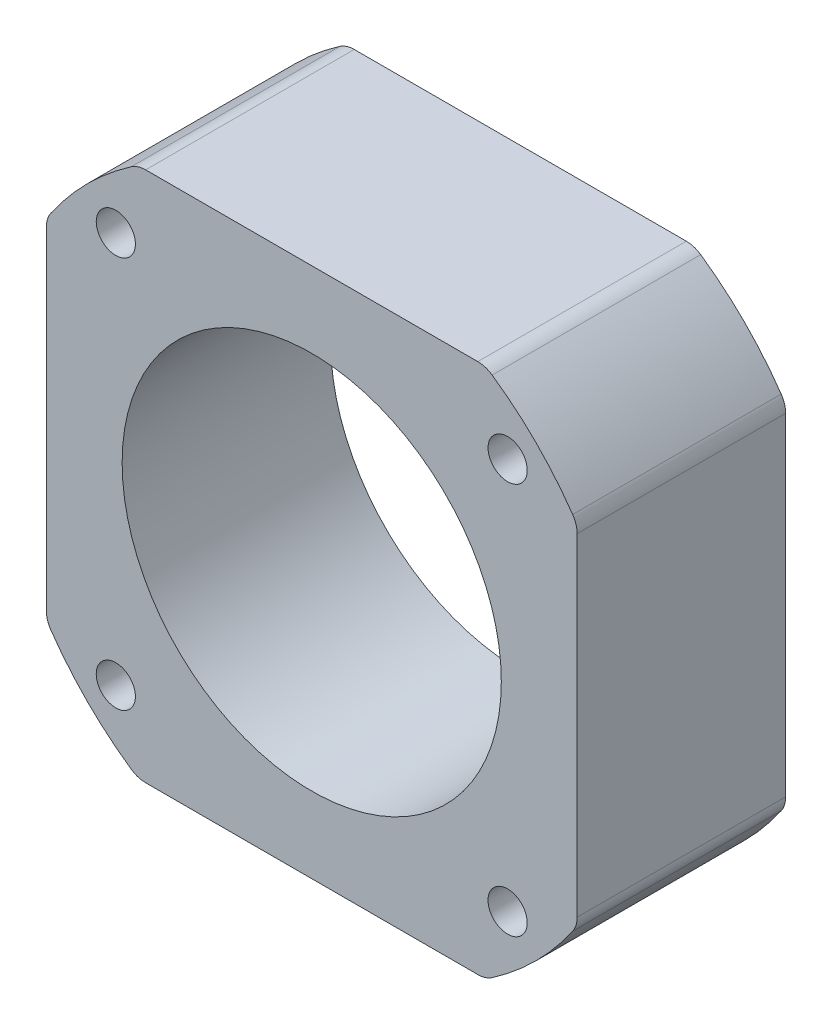
ISO-10303-21;
HEADER;
FILE_DESCRIPTION(('STEP AP214'),'2;1');
FILE_NAME('part.step','',(''),(''),'','','');
FILE_SCHEMA(('AUTOMOTIVE_DESIGN { 1 0 10303 214 1 1 1 1 }'));
ENDSEC;
DATA;
#1=APPLICATION_CONTEXT('core data for automotive mechanical design processes');
#2=APPLICATION_PROTOCOL_DEFINITION('international standard','automotive_design',2000,#1);
#3=PRODUCT_CONTEXT('',#1,'mechanical');
#4=PRODUCT('Part','Part','',(#3));
#5=PRODUCT_RELATED_PRODUCT_CATEGORY('part','',(#4));
#6=PRODUCT_DEFINITION_FORMATION('','',#4);
#7=PRODUCT_DEFINITION_CONTEXT('part definition',#1,'design');
#8=PRODUCT_DEFINITION('design','',#6,#7);
#9=PRODUCT_DEFINITION_SHAPE('','',#8);
#10=(LENGTH_UNIT() NAMED_UNIT(*) SI_UNIT(.MILLI.,.METRE.));
#11=(NAMED_UNIT(*) PLANE_ANGLE_UNIT() SI_UNIT($,.RADIAN.));
#12=(NAMED_UNIT(*) SI_UNIT($,.STERADIAN.) SOLID_ANGLE_UNIT());
#13=UNCERTAINTY_MEASURE_WITH_UNIT(LENGTH_MEASURE(1.E-05),#10,'distance_accuracy_value','');
#14=(GEOMETRIC_REPRESENTATION_CONTEXT(3) GLOBAL_UNCERTAINTY_ASSIGNED_CONTEXT((#13)) GLOBAL_UNIT_ASSIGNED_CONTEXT((#10,
#11,#12)) REPRESENTATION_CONTEXT('',''));
#15=CARTESIAN_POINT('',(0.,0.,0.));
#16=DIRECTION('',(0.,0.,1.));
#17=DIRECTION('',(1.,0.,0.));
#18=AXIS2_PLACEMENT_3D('',#15,#16,#17);
#19=CARTESIAN_POINT('',(13.138112497615,19.,-30.425));
#20=DIRECTION('',(0.,0.,-1.));
#21=DIRECTION('',(-1.,0.,0.));
#22=AXIS2_PLACEMENT_3D('',#19,#20,#21);
#23=CYLINDRICAL_SURFACE('',#22,2.);
#24=CARTESIAN_POINT('',(13.138112497615,19.,-2.9));
#25=DIRECTION('',(0.,0.,-1.));
#26=DIRECTION('',(-1.,0.,0.));
#27=AXIS2_PLACEMENT_3D('',#24,#25,#26);
#28=CIRCLE('',#27,2.);
#29=CARTESIAN_POINT('',(13.138112497615,21.,-2.9));
#30=VERTEX_POINT('',#29);
#31=CARTESIAN_POINT('',(14.2756114151576,20.6450216450217,-2.9));
#32=VERTEX_POINT('',#31);
#33=EDGE_CURVE('E136',#30,#32,#28,.T.);
#34=ORIENTED_EDGE('',*,*,#33,.T.);
#35=DIRECTION('',(0.,0.,-1.));
#36=VECTOR('',#35,1.);
#37=CARTESIAN_POINT('',(14.2756114151578,20.6450216450217,-30.425));
#38=LINE('',#37,#36);
#39=CARTESIAN_POINT('',(14.2756114151576,20.6450216450217,-19.4));
#40=VERTEX_POINT('',#39);
#41=EDGE_CURVE('E134',#40,#32,#38,.F.);
#42=ORIENTED_EDGE('',*,*,#41,.F.);
#43=CARTESIAN_POINT('',(13.138112497615,19.,-19.4));
#44=DIRECTION('',(0.,0.,-1.));
#45=DIRECTION('',(-1.,0.,0.));
#46=AXIS2_PLACEMENT_3D('',#43,#44,#45);
#47=CIRCLE('',#46,2.);
#48=CARTESIAN_POINT('',(13.138112497615,21.,-19.4));
#49=VERTEX_POINT('',#48);
#50=EDGE_CURVE('E19',#40,#49,#47,.F.);
#51=ORIENTED_EDGE('',*,*,#50,.T.);
#52=DIRECTION('',(0.,0.,1.));
#53=VECTOR('',#52,1.);
#54=CARTESIAN_POINT('',(13.138112497615,21.,-8.425));
#55=LINE('',#54,#53);
#56=EDGE_CURVE('E131',#30,#49,#55,.F.);
#57=ORIENTED_EDGE('',*,*,#56,.F.);
#58=EDGE_LOOP('',(#34,#42,#51,#57));
#59=FACE_BOUND('',#58,.T.);
#60=ADVANCED_FACE('F16',(#59),#23,.T.);
#61=CARTESIAN_POINT('',(19.,13.138112497615,-30.425));
#62=DIRECTION('',(0.,0.,-1.));
#63=DIRECTION('',(-1.,0.,0.));
#64=AXIS2_PLACEMENT_3D('',#61,#62,#63);
#65=CYLINDRICAL_SURFACE('',#64,2.);
#66=CARTESIAN_POINT('',(19.,13.138112497615,-2.9));
#67=DIRECTION('',(0.,0.,-1.));
#68=DIRECTION('',(-1.,0.,0.));
#69=AXIS2_PLACEMENT_3D('',#66,#67,#68);
#70=CIRCLE('',#69,2.);
#71=CARTESIAN_POINT('',(20.6450216450217,14.2756114151576,-2.9));
#72=VERTEX_POINT('',#71);
#73=CARTESIAN_POINT('',(21.,13.138112497615,-2.9));
#74=VERTEX_POINT('',#73);
#75=EDGE_CURVE('E276',#72,#74,#70,.T.);
#76=ORIENTED_EDGE('',*,*,#75,.T.);
#77=DIRECTION('',(0.,0.,-1.));
#78=VECTOR('',#77,1.);
#79=CARTESIAN_POINT('',(21.,13.138112497615,-8.425));
#80=LINE('',#79,#78);
#81=CARTESIAN_POINT('',(21.,13.138112497615,-19.4));
#82=VERTEX_POINT('',#81);
#83=EDGE_CURVE('E198',#82,#74,#80,.F.);
#84=ORIENTED_EDGE('',*,*,#83,.F.);
#85=CARTESIAN_POINT('',(19.,13.138112497615,-19.4));
#86=DIRECTION('',(0.,0.,-1.));
#87=DIRECTION('',(-1.,0.,0.));
#88=AXIS2_PLACEMENT_3D('',#85,#86,#87);
#89=CIRCLE('',#88,2.);
#90=CARTESIAN_POINT('',(20.6450216450217,14.2756114151576,-19.4));
#91=VERTEX_POINT('',#90);
#92=EDGE_CURVE('E278',#82,#91,#89,.F.);
#93=ORIENTED_EDGE('',*,*,#92,.T.);
#94=DIRECTION('',(0.,0.,-1.));
#95=VECTOR('',#94,1.);
#96=CARTESIAN_POINT('',(20.6450216450217,14.2756114151578,-30.425));
#97=LINE('',#96,#95);
#98=EDGE_CURVE('E201',#72,#91,#97,.T.);
#99=ORIENTED_EDGE('',*,*,#98,.F.);
#100=EDGE_LOOP('',(#76,#84,#93,#99));
#101=FACE_BOUND('',#100,.T.);
#102=ADVANCED_FACE('F288',(#101),#65,.T.);
#103=CARTESIAN_POINT('',(19.,-13.13811249761,-30.425));
#104=DIRECTION('',(0.,0.,-1.));
#105=DIRECTION('',(-1.,0.,0.));
#106=AXIS2_PLACEMENT_3D('',#103,#104,#105);
#107=CYLINDRICAL_SURFACE('',#106,2.);
#108=CARTESIAN_POINT('',(19.,-13.13811249761,-2.9));
#109=DIRECTION('',(0.,0.,-1.));
#110=DIRECTION('',(-1.,0.,0.));
#111=AXIS2_PLACEMENT_3D('',#108,#109,#110);
#112=CIRCLE('',#111,2.);
#113=CARTESIAN_POINT('',(21.,-13.13811249761,-2.9));
#114=VERTEX_POINT('',#113);
#115=CARTESIAN_POINT('',(20.6450216450237,-14.2756114151523,-2.9));
#116=VERTEX_POINT('',#115);
#117=EDGE_CURVE('E272',#114,#116,#112,.T.);
#118=ORIENTED_EDGE('',*,*,#117,.T.);
#119=DIRECTION('',(0.,0.,-1.));
#120=VECTOR('',#119,1.);
#121=CARTESIAN_POINT('',(20.6450216450255,-14.2756114151524,-30.425));
#122=LINE('',#121,#120);
#123=CARTESIAN_POINT('',(20.6450216450237,-14.2756114151523,-19.4));
#124=VERTEX_POINT('',#123);
#125=EDGE_CURVE('E192',#124,#116,#122,.F.);
#126=ORIENTED_EDGE('',*,*,#125,.F.);
#127=CARTESIAN_POINT('',(19.,-13.13811249761,-19.4));
#128=DIRECTION('',(0.,0.,-1.));
#129=DIRECTION('',(-1.,0.,0.));
#130=AXIS2_PLACEMENT_3D('',#127,#128,#129);
#131=CIRCLE('',#130,2.);
#132=CARTESIAN_POINT('',(21.,-13.13811249761,-19.4));
#133=VERTEX_POINT('',#132);
#134=EDGE_CURVE('E274',#124,#133,#131,.F.);
#135=ORIENTED_EDGE('',*,*,#134,.T.);
#136=DIRECTION('',(0.,0.,-1.));
#137=VECTOR('',#136,1.);
#138=CARTESIAN_POINT('',(21.,-13.13811249761,-8.425));
#139=LINE('',#138,#137);
#140=EDGE_CURVE('E195',#114,#133,#139,.T.);
#141=ORIENTED_EDGE('',*,*,#140,.F.);
#142=EDGE_LOOP('',(#118,#126,#135,#141));
#143=FACE_BOUND('',#142,.T.);
#144=ADVANCED_FACE('F294',(#143),#107,.T.);
#145=CARTESIAN_POINT('',(13.138112497615,-19.,-30.425));
#146=DIRECTION('',(0.,0.,-1.));
#147=DIRECTION('',(-1.,0.,0.));
#148=AXIS2_PLACEMENT_3D('',#145,#146,#147);
#149=CYLINDRICAL_SURFACE('',#148,2.);
#150=CARTESIAN_POINT('',(13.138112497615,-19.,-2.9));
#151=DIRECTION('',(0.,0.,-1.));
#152=DIRECTION('',(-1.,0.,0.));
#153=AXIS2_PLACEMENT_3D('',#150,#151,#152);
#154=CIRCLE('',#153,2.);
#155=CARTESIAN_POINT('',(14.2756114151581,-20.6450216450214,-2.9));
#156=VERTEX_POINT('',#155);
#157=CARTESIAN_POINT('',(13.138112497615,-21.,-2.9));
#158=VERTEX_POINT('',#157);
#159=EDGE_CURVE('E268',#156,#158,#154,.T.);
#160=ORIENTED_EDGE('',*,*,#159,.T.);
#161=DIRECTION('',(0.,0.,-1.));
#162=VECTOR('',#161,1.);
#163=CARTESIAN_POINT('',(13.138112497615,-21.,-8.425));
#164=LINE('',#163,#162);
#165=CARTESIAN_POINT('',(13.138112497615,-21.,-19.4));
#166=VERTEX_POINT('',#165);
#167=EDGE_CURVE('E186',#166,#158,#164,.F.);
#168=ORIENTED_EDGE('',*,*,#167,.F.);
#169=CARTESIAN_POINT('',(13.138112497615,-19.,-19.4));
#170=DIRECTION('',(0.,0.,-1.));
#171=DIRECTION('',(-1.,0.,0.));
#172=AXIS2_PLACEMENT_3D('',#169,#170,#171);
#173=CIRCLE('',#172,2.);
#174=CARTESIAN_POINT('',(14.2756114151581,-20.6450216450214,-19.4));
#175=VERTEX_POINT('',#174);
#176=EDGE_CURVE('E270',#166,#175,#173,.F.);
#177=ORIENTED_EDGE('',*,*,#176,.T.);
#178=DIRECTION('',(0.,0.,-1.));
#179=VECTOR('',#178,1.);
#180=CARTESIAN_POINT('',(14.2756114151588,-20.6450216450211,-30.425));
#181=LINE('',#180,#179);
#182=EDGE_CURVE('E189',#156,#175,#181,.T.);
#183=ORIENTED_EDGE('',*,*,#182,.F.);
#184=EDGE_LOOP('',(#160,#168,#177,#183));
#185=FACE_BOUND('',#184,.T.);
#186=ADVANCED_FACE('F304',(#185),#149,.T.);
#187=CARTESIAN_POINT('',(-13.13811249761,-19.,-30.425));
#188=DIRECTION('',(0.,0.,-1.));
#189=DIRECTION('',(-1.,0.,0.));
#190=AXIS2_PLACEMENT_3D('',#187,#188,#189);
#191=CYLINDRICAL_SURFACE('',#190,2.);
#192=CARTESIAN_POINT('',(-13.13811249761,-19.,-2.9));
#193=DIRECTION('',(0.,0.,-1.));
#194=DIRECTION('',(-1.,0.,0.));
#195=AXIS2_PLACEMENT_3D('',#192,#193,#194);
#196=CIRCLE('',#195,2.);
#197=CARTESIAN_POINT('',(-13.13811249761,-21.,-2.9));
#198=VERTEX_POINT('',#197);
#199=CARTESIAN_POINT('',(-14.2756114151527,-20.6450216450234,-2.9));
#200=VERTEX_POINT('',#199);
#201=EDGE_CURVE('E264',#198,#200,#196,.T.);
#202=ORIENTED_EDGE('',*,*,#201,.T.);
#203=DIRECTION('',(0.,0.,-1.));
#204=VECTOR('',#203,1.);
#205=CARTESIAN_POINT('',(-14.2756114151533,-20.6450216450248,-30.425));
#206=LINE('',#205,#204);
#207=CARTESIAN_POINT('',(-14.2756114151527,-20.6450216450234,-19.4));
#208=VERTEX_POINT('',#207);
#209=EDGE_CURVE('E180',#208,#200,#206,.F.);
#210=ORIENTED_EDGE('',*,*,#209,.F.);
#211=CARTESIAN_POINT('',(-13.13811249761,-19.,-19.4));
#212=DIRECTION('',(0.,0.,-1.));
#213=DIRECTION('',(-1.,0.,0.));
#214=AXIS2_PLACEMENT_3D('',#211,#212,#213);
#215=CIRCLE('',#214,2.);
#216=CARTESIAN_POINT('',(-13.13811249761,-21.,-19.4));
#217=VERTEX_POINT('',#216);
#218=EDGE_CURVE('E266',#208,#217,#215,.F.);
#219=ORIENTED_EDGE('',*,*,#218,.T.);
#220=DIRECTION('',(0.,0.,-1.));
#221=VECTOR('',#220,1.);
#222=CARTESIAN_POINT('',(-13.13811249761,-21.,-8.425));
#223=LINE('',#222,#221);
#224=EDGE_CURVE('E183',#198,#217,#223,.T.);
#225=ORIENTED_EDGE('',*,*,#224,.F.);
#226=EDGE_LOOP('',(#202,#210,#219,#225));
#227=FACE_BOUND('',#226,.T.);
#228=ADVANCED_FACE('F312',(#227),#191,.T.);
#229=CARTESIAN_POINT('',(-19.,-13.13811249761,-30.425));
#230=DIRECTION('',(0.,0.,-1.));
#231=DIRECTION('',(-1.,0.,0.));
#232=AXIS2_PLACEMENT_3D('',#229,#230,#231);
#233=CYLINDRICAL_SURFACE('',#232,2.);
#234=CARTESIAN_POINT('',(-19.,-13.13811249761,-2.9));
#235=DIRECTION('',(0.,0.,-1.));
#236=DIRECTION('',(-1.,0.,0.));
#237=AXIS2_PLACEMENT_3D('',#234,#235,#236);
#238=CIRCLE('',#237,2.);
#239=CARTESIAN_POINT('',(-20.6450216450233,-14.2756114151527,-2.9));
#240=VERTEX_POINT('',#239);
#241=CARTESIAN_POINT('',(-21.,-13.13811249761,-2.9));
#242=VERTEX_POINT('',#241);
#243=EDGE_CURVE('E260',#240,#242,#238,.T.);
#244=ORIENTED_EDGE('',*,*,#243,.T.);
#245=DIRECTION('',(0.,0.,1.));
#246=VECTOR('',#245,1.);
#247=CARTESIAN_POINT('',(-21.,-13.13811249761,-8.425));
#248=LINE('',#247,#246);
#249=CARTESIAN_POINT('',(-21.,-13.13811249761,-19.4));
#250=VERTEX_POINT('',#249);
#251=EDGE_CURVE('E174',#250,#242,#248,.T.);
#252=ORIENTED_EDGE('',*,*,#251,.F.);
#253=CARTESIAN_POINT('',(-19.,-13.13811249761,-19.4));
#254=DIRECTION('',(0.,0.,-1.));
#255=DIRECTION('',(-1.,0.,0.));
#256=AXIS2_PLACEMENT_3D('',#253,#254,#255);
#257=CIRCLE('',#256,2.);
#258=CARTESIAN_POINT('',(-20.6450216450233,-14.2756114151527,-19.4));
#259=VERTEX_POINT('',#258);
#260=EDGE_CURVE('E262',#250,#259,#257,.F.);
#261=ORIENTED_EDGE('',*,*,#260,.T.);
#262=DIRECTION('',(0.,0.,-1.));
#263=VECTOR('',#262,1.);
#264=CARTESIAN_POINT('',(-20.6450216450248,-14.2756114151533,-30.425));
#265=LINE('',#264,#263);
#266=EDGE_CURVE('E177',#240,#259,#265,.T.);
#267=ORIENTED_EDGE('',*,*,#266,.F.);
#268=EDGE_LOOP('',(#244,#252,#261,#267));
#269=FACE_BOUND('',#268,.T.);
#270=ADVANCED_FACE('F318',(#269),#233,.T.);
#271=CARTESIAN_POINT('',(-19.,13.138112497615,-30.425));
#272=DIRECTION('',(0.,0.,-1.));
#273=DIRECTION('',(-1.,0.,0.));
#274=AXIS2_PLACEMENT_3D('',#271,#272,#273);
#275=CYLINDRICAL_SURFACE('',#274,2.);
#276=CARTESIAN_POINT('',(-19.,13.138112497615,-2.9));
#277=DIRECTION('',(0.,0.,-1.));
#278=DIRECTION('',(-1.,0.,0.));
#279=AXIS2_PLACEMENT_3D('',#276,#277,#278);
#280=CIRCLE('',#279,2.);
#281=CARTESIAN_POINT('',(-21.,13.138112497615,-2.9));
#282=VERTEX_POINT('',#281);
#283=CARTESIAN_POINT('',(-20.6450216450214,14.2756114151581,-2.9));
#284=VERTEX_POINT('',#283);
#285=EDGE_CURVE('E256',#282,#284,#280,.T.);
#286=ORIENTED_EDGE('',*,*,#285,.T.);
#287=DIRECTION('',(0.,0.,-1.));
#288=VECTOR('',#287,1.);
#289=CARTESIAN_POINT('',(-20.6450216450211,14.2756114151587,-30.425));
#290=LINE('',#289,#288);
#291=CARTESIAN_POINT('',(-20.6450216450214,14.2756114151581,-19.4));
#292=VERTEX_POINT('',#291);
#293=EDGE_CURVE('E168',#292,#284,#290,.F.);
#294=ORIENTED_EDGE('',*,*,#293,.F.);
#295=CARTESIAN_POINT('',(-19.,13.138112497615,-19.4));
#296=DIRECTION('',(0.,0.,-1.));
#297=DIRECTION('',(-1.,0.,0.));
#298=AXIS2_PLACEMENT_3D('',#295,#296,#297);
#299=CIRCLE('',#298,2.);
#300=CARTESIAN_POINT('',(-21.,13.138112497615,-19.4));
#301=VERTEX_POINT('',#300);
#302=EDGE_CURVE('E258',#292,#301,#299,.F.);
#303=ORIENTED_EDGE('',*,*,#302,.T.);
#304=DIRECTION('',(0.,0.,1.));
#305=VECTOR('',#304,1.);
#306=CARTESIAN_POINT('',(-21.,13.138112497615,-8.425));
#307=LINE('',#306,#305);
#308=EDGE_CURVE('E171',#282,#301,#307,.F.);
#309=ORIENTED_EDGE('',*,*,#308,.F.);
#310=EDGE_LOOP('',(#286,#294,#303,#309));
#311=FACE_BOUND('',#310,.T.);
#312=ADVANCED_FACE('F329',(#311),#275,.T.);
#313=CARTESIAN_POINT('',(-13.13811249761,19.,-30.425));
#314=DIRECTION('',(0.,0.,-1.));
#315=DIRECTION('',(-1.,0.,0.));
#316=AXIS2_PLACEMENT_3D('',#313,#314,#315);
#317=CYLINDRICAL_SURFACE('',#316,2.);
#318=CARTESIAN_POINT('',(-13.13811249761,19.,-2.9));
#319=DIRECTION('',(0.,0.,-1.));
#320=DIRECTION('',(-1.,0.,0.));
#321=AXIS2_PLACEMENT_3D('',#318,#319,#320);
#322=CIRCLE('',#321,2.);
#323=CARTESIAN_POINT('',(-14.2756114151523,20.6450216450237,-2.9));
#324=VERTEX_POINT('',#323);
#325=CARTESIAN_POINT('',(-13.13811249761,21.,-2.9));
#326=VERTEX_POINT('',#325);
#327=EDGE_CURVE('E34',#324,#326,#322,.T.);
#328=ORIENTED_EDGE('',*,*,#327,.T.);
#329=DIRECTION('',(0.,0.,1.));
#330=VECTOR('',#329,1.);
#331=CARTESIAN_POINT('',(-13.13811249761,21.,-8.425));
#332=LINE('',#331,#330);
#333=CARTESIAN_POINT('',(-13.13811249761,21.,-19.4));
#334=VERTEX_POINT('',#333);
#335=EDGE_CURVE('E143',#334,#326,#332,.T.);
#336=ORIENTED_EDGE('',*,*,#335,.F.);
#337=CARTESIAN_POINT('',(-13.13811249761,19.,-19.4));
#338=DIRECTION('',(0.,0.,-1.));
#339=DIRECTION('',(-1.,0.,0.));
#340=AXIS2_PLACEMENT_3D('',#337,#338,#339);
#341=CIRCLE('',#340,2.);
#342=CARTESIAN_POINT('',(-14.2756114151523,20.6450216450237,-19.4));
#343=VERTEX_POINT('',#342);
#344=EDGE_CURVE('E148',#334,#343,#341,.F.);
#345=ORIENTED_EDGE('',*,*,#344,.T.);
#346=DIRECTION('',(0.,0.,-1.));
#347=VECTOR('',#346,1.);
#348=CARTESIAN_POINT('',(-14.2756114151524,20.6450216450255,-30.425));
#349=LINE('',#348,#347);
#350=EDGE_CURVE('E167',#324,#343,#349,.T.);
#351=ORIENTED_EDGE('',*,*,#350,.F.);
#352=EDGE_LOOP('',(#328,#336,#345,#351));
#353=FACE_BOUND('',#352,.T.);
#354=ADVANCED_FACE('F333',(#353),#317,.T.);
#355=CARTESIAN_POINT('',(-13.13811249761,21.,-8.425));
#356=DIRECTION('',(0.,1.,0.));
#357=DIRECTION('',(0.,0.,1.));
#358=AXIS2_PLACEMENT_3D('',#355,#356,#357);
#359=PLANE('',#358);
#360=DIRECTION('',(-1.,0.,0.));
#361=VECTOR('',#360,1.);
#362=CARTESIAN_POINT('',(0.,21.,-2.9));
#363=LINE('',#362,#361);
#364=EDGE_CURVE('E142',#326,#30,#363,.F.);
#365=ORIENTED_EDGE('',*,*,#364,.T.);
#366=ORIENTED_EDGE('',*,*,#56,.T.);
#367=DIRECTION('',(1.,0.,0.));
#368=VECTOR('',#367,1.);
#369=CARTESIAN_POINT('',(-1.50000002235174,21.,-19.4));
#370=LINE('',#369,#368);
#371=EDGE_CURVE('E141',#49,#334,#370,.F.);
#372=ORIENTED_EDGE('',*,*,#371,.T.);
#373=ORIENTED_EDGE('',*,*,#335,.T.);
#374=EDGE_LOOP('',(#365,#366,#372,#373));
#375=FACE_BOUND('',#374,.T.);
#376=ADVANCED_FACE('F139',(#375),#359,.T.);
#377=CARTESIAN_POINT('',(0.,0.,-30.425));
#378=DIRECTION('',(0.,0.,-1.));
#379=DIRECTION('',(-1.,0.,0.));
#380=AXIS2_PLACEMENT_3D('',#377,#378,#379);
#381=CYLINDRICAL_SURFACE('',#380,25.1);
#382=CARTESIAN_POINT('',(0.,0.,-2.9));
#383=DIRECTION('',(0.,0.,-1.));
#384=DIRECTION('',(-1.,0.,0.));
#385=AXIS2_PLACEMENT_3D('',#382,#383,#384);
#386=CIRCLE('',#385,25.1);
#387=EDGE_CURVE('E234',#32,#72,#386,.T.);
#388=ORIENTED_EDGE('',*,*,#387,.T.);
#389=ORIENTED_EDGE('',*,*,#98,.T.);
#390=CARTESIAN_POINT('',(0.,0.,-19.4));
#391=DIRECTION('',(0.,0.,-1.));
#392=DIRECTION('',(-1.,0.,0.));
#393=AXIS2_PLACEMENT_3D('',#390,#391,#392);
#394=CIRCLE('',#393,25.1);
#395=EDGE_CURVE('E151',#91,#40,#394,.F.);
#396=ORIENTED_EDGE('',*,*,#395,.T.);
#397=ORIENTED_EDGE('',*,*,#41,.T.);
#398=EDGE_LOOP('',(#388,#389,#396,#397));
#399=FACE_BOUND('',#398,.T.);
#400=ADVANCED_FACE('F281',(#399),#381,.T.);
#401=CARTESIAN_POINT('',(21.,13.138112497615,-8.425));
#402=DIRECTION('',(1.,0.,0.));
#403=DIRECTION('',(0.,0.,-1.));
#404=AXIS2_PLACEMENT_3D('',#401,#402,#403);
#405=PLANE('',#404);
#406=DIRECTION('',(0.,1.,0.));
#407=VECTOR('',#406,1.);
#408=CARTESIAN_POINT('',(21.,0.,-2.9));
#409=LINE('',#408,#407);
#410=EDGE_CURVE('E233',#74,#114,#409,.F.);
#411=ORIENTED_EDGE('',*,*,#410,.T.);
#412=ORIENTED_EDGE('',*,*,#140,.T.);
#413=DIRECTION('',(0.,1.,0.));
#414=VECTOR('',#413,1.);
#415=CARTESIAN_POINT('',(21.,-2.00000002980232,-19.4));
#416=LINE('',#415,#414);
#417=EDGE_CURVE('E156',#133,#82,#416,.T.);
#418=ORIENTED_EDGE('',*,*,#417,.T.);
#419=ORIENTED_EDGE('',*,*,#83,.T.);
#420=EDGE_LOOP('',(#411,#412,#418,#419));
#421=FACE_BOUND('',#420,.T.);
#422=ADVANCED_FACE('F291',(#421),#405,.T.);
#423=CARTESIAN_POINT('',(0.,0.,-30.425));
#424=DIRECTION('',(0.,0.,-1.));
#425=DIRECTION('',(-1.,0.,0.));
#426=AXIS2_PLACEMENT_3D('',#423,#424,#425);
#427=CYLINDRICAL_SURFACE('',#426,25.1);
#428=CARTESIAN_POINT('',(0.,0.,-2.9));
#429=DIRECTION('',(0.,0.,-1.));
#430=DIRECTION('',(-1.,0.,0.));
#431=AXIS2_PLACEMENT_3D('',#428,#429,#430);
#432=CIRCLE('',#431,25.1);
#433=EDGE_CURVE('E230',#116,#156,#432,.T.);
#434=ORIENTED_EDGE('',*,*,#433,.T.);
#435=ORIENTED_EDGE('',*,*,#182,.T.);
#436=CARTESIAN_POINT('',(0.,0.,-19.4));
#437=DIRECTION('',(0.,0.,-1.));
#438=DIRECTION('',(-1.,0.,0.));
#439=AXIS2_PLACEMENT_3D('',#436,#437,#438);
#440=CIRCLE('',#439,25.1);
#441=EDGE_CURVE('E163',#175,#124,#440,.F.);
#442=ORIENTED_EDGE('',*,*,#441,.T.);
#443=ORIENTED_EDGE('',*,*,#125,.T.);
#444=EDGE_LOOP('',(#434,#435,#442,#443));
#445=FACE_BOUND('',#444,.T.);
#446=ADVANCED_FACE('F300',(#445),#427,.T.);
#447=CARTESIAN_POINT('',(13.138112497615,-21.,-8.425));
#448=DIRECTION('',(0.,-1.,0.));
#449=DIRECTION('',(0.,0.,-1.));
#450=AXIS2_PLACEMENT_3D('',#447,#448,#449);
#451=PLANE('',#450);
#452=DIRECTION('',(-1.,0.,0.));
#453=VECTOR('',#452,1.);
#454=CARTESIAN_POINT('',(0.,-21.,-2.9));
#455=LINE('',#454,#453);
#456=EDGE_CURVE('E229',#158,#198,#455,.T.);
#457=ORIENTED_EDGE('',*,*,#456,.T.);
#458=ORIENTED_EDGE('',*,*,#224,.T.);
#459=DIRECTION('',(1.,0.,0.));
#460=VECTOR('',#459,1.);
#461=CARTESIAN_POINT('',(-1.50000002235174,-21.,-19.4));
#462=LINE('',#461,#460);
#463=EDGE_CURVE('E164',#217,#166,#462,.T.);
#464=ORIENTED_EDGE('',*,*,#463,.T.);
#465=ORIENTED_EDGE('',*,*,#167,.T.);
#466=EDGE_LOOP('',(#457,#458,#464,#465));
#467=FACE_BOUND('',#466,.T.);
#468=ADVANCED_FACE('F308',(#467),#451,.T.);
#469=CARTESIAN_POINT('',(0.,0.,-30.425));
#470=DIRECTION('',(0.,0.,-1.));
#471=DIRECTION('',(-1.,0.,0.));
#472=AXIS2_PLACEMENT_3D('',#469,#470,#471);
#473=CYLINDRICAL_SURFACE('',#472,25.1);
#474=CARTESIAN_POINT('',(0.,0.,-2.9));
#475=DIRECTION('',(0.,0.,-1.));
#476=DIRECTION('',(-1.,0.,0.));
#477=AXIS2_PLACEMENT_3D('',#474,#475,#476);
#478=CIRCLE('',#477,25.1);
#479=EDGE_CURVE('E226',#200,#240,#478,.T.);
#480=ORIENTED_EDGE('',*,*,#479,.T.);
#481=ORIENTED_EDGE('',*,*,#266,.T.);
#482=CARTESIAN_POINT('',(0.,0.,-19.4));
#483=DIRECTION('',(0.,0.,-1.));
#484=DIRECTION('',(-1.,0.,0.));
#485=AXIS2_PLACEMENT_3D('',#482,#483,#484);
#486=CIRCLE('',#485,25.1);
#487=EDGE_CURVE('E249',#259,#208,#486,.F.);
#488=ORIENTED_EDGE('',*,*,#487,.T.);
#489=ORIENTED_EDGE('',*,*,#209,.T.);
#490=EDGE_LOOP('',(#480,#481,#488,#489));
#491=FACE_BOUND('',#490,.T.);
#492=ADVANCED_FACE('F315',(#491),#473,.T.);
#493=CARTESIAN_POINT('',(-21.,-13.13811249761,-8.425));
#494=DIRECTION('',(-1.,0.,0.));
#495=DIRECTION('',(0.,-1.,0.));
#496=AXIS2_PLACEMENT_3D('',#493,#494,#495);
#497=PLANE('',#496);
#498=DIRECTION('',(0.,1.,0.));
#499=VECTOR('',#498,1.);
#500=CARTESIAN_POINT('',(-21.,0.,-2.9));
#501=LINE('',#500,#499);
#502=EDGE_CURVE('E225',#242,#282,#501,.T.);
#503=ORIENTED_EDGE('',*,*,#502,.T.);
#504=ORIENTED_EDGE('',*,*,#308,.T.);
#505=DIRECTION('',(0.,1.,0.));
#506=VECTOR('',#505,1.);
#507=CARTESIAN_POINT('',(-21.,-2.00000002980232,-19.4));
#508=LINE('',#507,#506);
#509=EDGE_CURVE('E154',#301,#250,#508,.F.);
#510=ORIENTED_EDGE('',*,*,#509,.T.);
#511=ORIENTED_EDGE('',*,*,#251,.T.);
#512=EDGE_LOOP('',(#503,#504,#510,#511));
#513=FACE_BOUND('',#512,.T.);
#514=ADVANCED_FACE('F325',(#513),#497,.T.);
#515=CARTESIAN_POINT('',(0.,0.,-30.425));
#516=DIRECTION('',(0.,0.,-1.));
#517=DIRECTION('',(-1.,0.,0.));
#518=AXIS2_PLACEMENT_3D('',#515,#516,#517);
#519=CYLINDRICAL_SURFACE('',#518,25.1);
#520=CARTESIAN_POINT('',(0.,0.,-2.9));
#521=DIRECTION('',(0.,0.,-1.));
#522=DIRECTION('',(-1.,0.,0.));
#523=AXIS2_PLACEMENT_3D('',#520,#521,#522);
#524=CIRCLE('',#523,25.1);
#525=EDGE_CURVE('E222',#284,#324,#524,.T.);
#526=ORIENTED_EDGE('',*,*,#525,.T.);
#527=ORIENTED_EDGE('',*,*,#350,.T.);
#528=CARTESIAN_POINT('',(0.,0.,-19.4));
#529=DIRECTION('',(0.,0.,-1.));
#530=DIRECTION('',(-1.,0.,0.));
#531=AXIS2_PLACEMENT_3D('',#528,#529,#530);
#532=CIRCLE('',#531,25.1);
#533=EDGE_CURVE('E150',#343,#292,#532,.F.);
#534=ORIENTED_EDGE('',*,*,#533,.T.);
#535=ORIENTED_EDGE('',*,*,#293,.T.);
#536=EDGE_LOOP('',(#526,#527,#534,#535));
#537=FACE_BOUND('',#536,.T.);
#538=ADVANCED_FACE('F331',(#537),#519,.T.);
#539=CARTESIAN_POINT('',(-15.5,-15.5,-30.425));
#540=DIRECTION('',(0.,0.,-1.));
#541=DIRECTION('',(-1.,0.,0.));
#542=AXIS2_PLACEMENT_3D('',#539,#540,#541);
#543=CYLINDRICAL_SURFACE('',#542,1.55);
#544=CARTESIAN_POINT('',(-15.5,-15.5,-19.4));
#545=DIRECTION('',(0.,0.,-1.));
#546=DIRECTION('',(-1.,0.,0.));
#547=AXIS2_PLACEMENT_3D('',#544,#545,#546);
#548=CIRCLE('',#547,1.55);
#549=CARTESIAN_POINT('',(-17.05,-15.5,-19.4));
#550=VERTEX_POINT('',#549);
#551=EDGE_CURVE('E246',#550,#550,#548,.T.);
#552=ORIENTED_EDGE('',*,*,#551,.T.);
#553=EDGE_LOOP('',(#552));
#554=FACE_BOUND('',#553,.T.);
#555=CARTESIAN_POINT('',(-15.5,-15.5,-2.9));
#556=DIRECTION('',(0.,0.,-1.));
#557=DIRECTION('',(-1.,0.,0.));
#558=AXIS2_PLACEMENT_3D('',#555,#556,#557);
#559=CIRCLE('',#558,1.55);
#560=CARTESIAN_POINT('',(-17.05,-15.5,-2.9));
#561=VERTEX_POINT('',#560);
#562=EDGE_CURVE('E219',#561,#561,#559,.F.);
#563=ORIENTED_EDGE('',*,*,#562,.T.);
#564=EDGE_LOOP('',(#563));
#565=FACE_BOUND('',#564,.T.);
#566=ADVANCED_FACE('F372',(#554,#565),#543,.F.);
#567=CARTESIAN_POINT('',(15.5,-15.5,-30.425));
#568=DIRECTION('',(0.,0.,-1.));
#569=DIRECTION('',(-1.,0.,0.));
#570=AXIS2_PLACEMENT_3D('',#567,#568,#569);
#571=CYLINDRICAL_SURFACE('',#570,1.55);
#572=CARTESIAN_POINT('',(15.5,-15.5,-19.4));
#573=DIRECTION('',(0.,0.,-1.));
#574=DIRECTION('',(-1.,0.,0.));
#575=AXIS2_PLACEMENT_3D('',#572,#573,#574);
#576=CIRCLE('',#575,1.55);
#577=CARTESIAN_POINT('',(13.95,-15.5,-19.4));
#578=VERTEX_POINT('',#577);
#579=EDGE_CURVE('E243',#578,#578,#576,.T.);
#580=ORIENTED_EDGE('',*,*,#579,.T.);
#581=EDGE_LOOP('',(#580));
#582=FACE_BOUND('',#581,.T.);
#583=CARTESIAN_POINT('',(15.5,-15.5,-2.9));
#584=DIRECTION('',(0.,0.,-1.));
#585=DIRECTION('',(-1.,0.,0.));
#586=AXIS2_PLACEMENT_3D('',#583,#584,#585);
#587=CIRCLE('',#586,1.55);
#588=CARTESIAN_POINT('',(13.95,-15.5,-2.9));
#589=VERTEX_POINT('',#588);
#590=EDGE_CURVE('E216',#589,#589,#587,.F.);
#591=ORIENTED_EDGE('',*,*,#590,.T.);
#592=EDGE_LOOP('',(#591));
#593=FACE_BOUND('',#592,.T.);
#594=ADVANCED_FACE('F368',(#582,#593),#571,.F.);
#595=CARTESIAN_POINT('',(15.5,15.5,-30.425));
#596=DIRECTION('',(0.,0.,-1.));
#597=DIRECTION('',(-1.,0.,0.));
#598=AXIS2_PLACEMENT_3D('',#595,#596,#597);
#599=CYLINDRICAL_SURFACE('',#598,1.55);
#600=CARTESIAN_POINT('',(15.5,15.5,-19.4));
#601=DIRECTION('',(0.,0.,-1.));
#602=DIRECTION('',(-1.,0.,0.));
#603=AXIS2_PLACEMENT_3D('',#600,#601,#602);
#604=CIRCLE('',#603,1.55);
#605=CARTESIAN_POINT('',(13.95,15.5,-19.4));
#606=VERTEX_POINT('',#605);
#607=EDGE_CURVE('E240',#606,#606,#604,.T.);
#608=ORIENTED_EDGE('',*,*,#607,.T.);
#609=EDGE_LOOP('',(#608));
#610=FACE_BOUND('',#609,.T.);
#611=CARTESIAN_POINT('',(15.5,15.5,-2.9));
#612=DIRECTION('',(0.,0.,-1.));
#613=DIRECTION('',(-1.,0.,0.));
#614=AXIS2_PLACEMENT_3D('',#611,#612,#613);
#615=CIRCLE('',#614,1.55);
#616=CARTESIAN_POINT('',(13.95,15.5,-2.9));
#617=VERTEX_POINT('',#616);
#618=EDGE_CURVE('E213',#617,#617,#615,.F.);
#619=ORIENTED_EDGE('',*,*,#618,.T.);
#620=EDGE_LOOP('',(#619));
#621=FACE_BOUND('',#620,.T.);
#622=ADVANCED_FACE('F364',(#610,#621),#599,.F.);
#623=CARTESIAN_POINT('',(-15.5,15.5,-30.425));
#624=DIRECTION('',(0.,0.,-1.));
#625=DIRECTION('',(-1.,0.,0.));
#626=AXIS2_PLACEMENT_3D('',#623,#624,#625);
#627=CYLINDRICAL_SURFACE('',#626,1.55);
#628=CARTESIAN_POINT('',(-15.5,15.5,-19.4));
#629=DIRECTION('',(0.,0.,-1.));
#630=DIRECTION('',(-1.,0.,0.));
#631=AXIS2_PLACEMENT_3D('',#628,#629,#630);
#632=CIRCLE('',#631,1.55);
#633=CARTESIAN_POINT('',(-17.05,15.5,-19.4));
#634=VERTEX_POINT('',#633);
#635=EDGE_CURVE('E237',#634,#634,#632,.T.);
#636=ORIENTED_EDGE('',*,*,#635,.T.);
#637=EDGE_LOOP('',(#636));
#638=FACE_BOUND('',#637,.T.);
#639=CARTESIAN_POINT('',(-15.5,15.5,-2.9));
#640=DIRECTION('',(0.,0.,-1.));
#641=DIRECTION('',(-1.,0.,0.));
#642=AXIS2_PLACEMENT_3D('',#639,#640,#641);
#643=CIRCLE('',#642,1.55);
#644=CARTESIAN_POINT('',(-17.05,15.5,-2.9));
#645=VERTEX_POINT('',#644);
#646=EDGE_CURVE('E210',#645,#645,#643,.F.);
#647=ORIENTED_EDGE('',*,*,#646,.T.);
#648=EDGE_LOOP('',(#647));
#649=FACE_BOUND('',#648,.T.);
#650=ADVANCED_FACE('F360',(#638,#649),#627,.F.);
#651=CARTESIAN_POINT('',(-1.50000002235174,-2.00000002980232,-19.4));
#652=DIRECTION('',(0.,0.,1.));
#653=DIRECTION('',(1.,0.,0.));
#654=AXIS2_PLACEMENT_3D('',#651,#652,#653);
#655=PLANE('',#654);
#656=ORIENTED_EDGE('',*,*,#635,.F.);
#657=EDGE_LOOP('',(#656));
#658=FACE_BOUND('',#657,.T.);
#659=ORIENTED_EDGE('',*,*,#607,.F.);
#660=EDGE_LOOP('',(#659));
#661=FACE_BOUND('',#660,.T.);
#662=ORIENTED_EDGE('',*,*,#579,.F.);
#663=EDGE_LOOP('',(#662));
#664=FACE_BOUND('',#663,.T.);
#665=ORIENTED_EDGE('',*,*,#551,.F.);
#666=EDGE_LOOP('',(#665));
#667=FACE_BOUND('',#666,.T.);
#668=CARTESIAN_POINT('',(0.,0.,-19.4));
#669=DIRECTION('',(0.,0.,-1.));
#670=DIRECTION('',(-1.,0.,0.));
#671=AXIS2_PLACEMENT_3D('',#668,#669,#670);
#672=CIRCLE('',#671,15.);
#673=CARTESIAN_POINT('',(-15.,0.,-19.4));
#674=VERTEX_POINT('',#673);
#675=EDGE_CURVE('E25',#674,#674,#672,.F.);
#676=ORIENTED_EDGE('',*,*,#675,.T.);
#677=EDGE_LOOP('',(#676));
#678=FACE_BOUND('',#677,.T.);
#679=ORIENTED_EDGE('',*,*,#487,.F.);
#680=ORIENTED_EDGE('',*,*,#260,.F.);
#681=ORIENTED_EDGE('',*,*,#509,.F.);
#682=ORIENTED_EDGE('',*,*,#302,.F.);
#683=ORIENTED_EDGE('',*,*,#533,.F.);
#684=ORIENTED_EDGE('',*,*,#344,.F.);
#685=ORIENTED_EDGE('',*,*,#371,.F.);
#686=ORIENTED_EDGE('',*,*,#50,.F.);
#687=ORIENTED_EDGE('',*,*,#395,.F.);
#688=ORIENTED_EDGE('',*,*,#92,.F.);
#689=ORIENTED_EDGE('',*,*,#417,.F.);
#690=ORIENTED_EDGE('',*,*,#134,.F.);
#691=ORIENTED_EDGE('',*,*,#441,.F.);
#692=ORIENTED_EDGE('',*,*,#176,.F.);
#693=ORIENTED_EDGE('',*,*,#463,.F.);
#694=ORIENTED_EDGE('',*,*,#218,.F.);
#695=EDGE_LOOP('',(#679,#680,#681,#682,#683,#684,#685,#686,#687,#688,#689,#690,#691,#692,#693,#694));
#696=FACE_BOUND('',#695,.T.);
#697=ADVANCED_FACE('F146',(#658,#661,#664,#667,#678,#696),#655,.F.);
#698=CARTESIAN_POINT('',(0.,0.,-2.9));
#699=DIRECTION('',(0.,0.,-1.));
#700=DIRECTION('',(-1.,0.,0.));
#701=AXIS2_PLACEMENT_3D('',#698,#699,#700);
#702=PLANE('',#701);
#703=ORIENTED_EDGE('',*,*,#646,.F.);
#704=EDGE_LOOP('',(#703));
#705=FACE_BOUND('',#704,.T.);
#706=ORIENTED_EDGE('',*,*,#618,.F.);
#707=EDGE_LOOP('',(#706));
#708=FACE_BOUND('',#707,.T.);
#709=ORIENTED_EDGE('',*,*,#590,.F.);
#710=EDGE_LOOP('',(#709));
#711=FACE_BOUND('',#710,.T.);
#712=ORIENTED_EDGE('',*,*,#562,.F.);
#713=EDGE_LOOP('',(#712));
#714=FACE_BOUND('',#713,.T.);
#715=CARTESIAN_POINT('',(0.,0.,-2.9));
#716=DIRECTION('',(0.,0.,-1.));
#717=DIRECTION('',(-1.,0.,0.));
#718=AXIS2_PLACEMENT_3D('',#715,#716,#717);
#719=CIRCLE('',#718,15.);
#720=CARTESIAN_POINT('',(-15.,0.,-2.9));
#721=VERTEX_POINT('',#720);
#722=EDGE_CURVE('E11',#721,#721,#719,.T.);
#723=ORIENTED_EDGE('',*,*,#722,.T.);
#724=EDGE_LOOP('',(#723));
#725=FACE_BOUND('',#724,.T.);
#726=ORIENTED_EDGE('',*,*,#525,.F.);
#727=ORIENTED_EDGE('',*,*,#285,.F.);
#728=ORIENTED_EDGE('',*,*,#502,.F.);
#729=ORIENTED_EDGE('',*,*,#243,.F.);
#730=ORIENTED_EDGE('',*,*,#479,.F.);
#731=ORIENTED_EDGE('',*,*,#201,.F.);
#732=ORIENTED_EDGE('',*,*,#456,.F.);
#733=ORIENTED_EDGE('',*,*,#159,.F.);
#734=ORIENTED_EDGE('',*,*,#433,.F.);
#735=ORIENTED_EDGE('',*,*,#117,.F.);
#736=ORIENTED_EDGE('',*,*,#410,.F.);
#737=ORIENTED_EDGE('',*,*,#75,.F.);
#738=ORIENTED_EDGE('',*,*,#387,.F.);
#739=ORIENTED_EDGE('',*,*,#33,.F.);
#740=ORIENTED_EDGE('',*,*,#364,.F.);
#741=ORIENTED_EDGE('',*,*,#327,.F.);
#742=EDGE_LOOP('',(#726,#727,#728,#729,#730,#731,#732,#733,#734,#735,#736,#737,#738,#739,#740,#741));
#743=FACE_BOUND('',#742,.T.);
#744=ADVANCED_FACE('F282',(#705,#708,#711,#714,#725,#743),#702,.F.);
#745=CARTESIAN_POINT('',(0.,0.,-30.425));
#746=DIRECTION('',(0.,0.,-1.));
#747=DIRECTION('',(-1.,0.,0.));
#748=AXIS2_PLACEMENT_3D('',#745,#746,#747);
#749=CYLINDRICAL_SURFACE('',#748,15.);
#750=ORIENTED_EDGE('',*,*,#675,.F.);
#751=EDGE_LOOP('',(#750));
#752=FACE_BOUND('',#751,.T.);
#753=ORIENTED_EDGE('',*,*,#722,.F.);
#754=EDGE_LOOP('',(#753));
#755=FACE_BOUND('',#754,.T.);
#756=ADVANCED_FACE('F346',(#752,#755),#749,.F.);
#757=CLOSED_SHELL('',(#60,#102,#144,#186,#228,#270,#312,#354,#376,#400,#422,#446,#468,#492,#514,
#538,#566,#594,#622,#650,#697,#744,#756));
#758=MANIFOLD_SOLID_BREP('B1',#757);
#759=ADVANCED_BREP_SHAPE_REPRESENTATION('',(#18,#758),#14);
#760=SHAPE_DEFINITION_REPRESENTATION(#9,#759);
ENDSEC;
END-ISO-10303-21;
